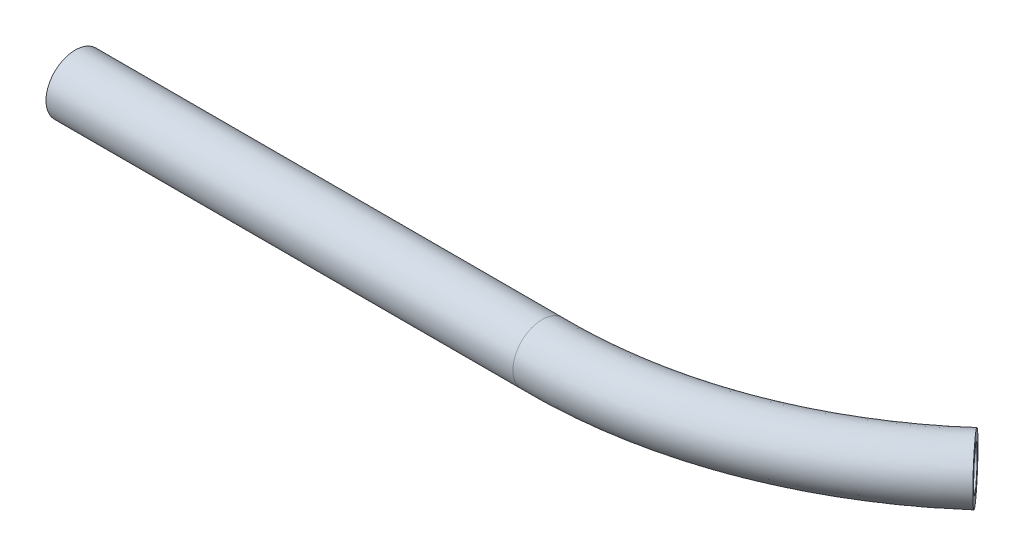
ISO-10303-21;
HEADER;
FILE_DESCRIPTION(('STEP AP214'),'2;1');
FILE_NAME('part.step','',(''),(''),'','','');
FILE_SCHEMA(('AUTOMOTIVE_DESIGN { 1 0 10303 214 1 1 1 1 }'));
ENDSEC;
DATA;
#1=APPLICATION_CONTEXT('core data for automotive mechanical design processes');
#2=APPLICATION_PROTOCOL_DEFINITION('international standard','automotive_design',2000,#1);
#3=PRODUCT_CONTEXT('',#1,'mechanical');
#4=PRODUCT('Part','Part','',(#3));
#5=PRODUCT_RELATED_PRODUCT_CATEGORY('part','',(#4));
#6=PRODUCT_DEFINITION_FORMATION('','',#4);
#7=PRODUCT_DEFINITION_CONTEXT('part definition',#1,'design');
#8=PRODUCT_DEFINITION('design','',#6,#7);
#9=PRODUCT_DEFINITION_SHAPE('','',#8);
#10=(LENGTH_UNIT() NAMED_UNIT(*) SI_UNIT(.MILLI.,.METRE.));
#11=(NAMED_UNIT(*) PLANE_ANGLE_UNIT() SI_UNIT($,.RADIAN.));
#12=(NAMED_UNIT(*) SI_UNIT($,.STERADIAN.) SOLID_ANGLE_UNIT());
#13=UNCERTAINTY_MEASURE_WITH_UNIT(LENGTH_MEASURE(1.E-05),#10,'distance_accuracy_value','');
#14=(GEOMETRIC_REPRESENTATION_CONTEXT(3) GLOBAL_UNCERTAINTY_ASSIGNED_CONTEXT((#13)) GLOBAL_UNIT_ASSIGNED_CONTEXT((#10,
#11,#12)) REPRESENTATION_CONTEXT('',''));
#15=CARTESIAN_POINT('',(0.,0.,0.));
#16=DIRECTION('',(0.,0.,1.));
#17=DIRECTION('',(1.,0.,0.));
#18=AXIS2_PLACEMENT_3D('',#15,#16,#17);
#19=CARTESIAN_POINT('',(-38.1,0.,0.));
#20=DIRECTION('',(1.,0.,0.));
#21=DIRECTION('',(0.,0.,-1.));
#22=AXIS2_PLACEMENT_3D('',#19,#20,#21);
#23=PLANE('',#22);
#24=CARTESIAN_POINT('',(-38.1,0.,0.));
#25=DIRECTION('',(1.,0.,0.));
#26=DIRECTION('',(0.,0.,-1.));
#27=AXIS2_PLACEMENT_3D('',#24,#25,#26);
#28=CIRCLE('',#27,4.7625);
#29=CARTESIAN_POINT('',(-38.1,0.,4.7625));
#30=VERTEX_POINT('',#29);
#31=EDGE_CURVE('E36',#30,#30,#28,.T.);
#32=ORIENTED_EDGE('',*,*,#31,.F.);
#33=EDGE_LOOP('',(#32));
#34=FACE_BOUND('',#33,.T.);
#35=CARTESIAN_POINT('',(-38.1,0.,0.));
#36=DIRECTION('',(1.,0.,0.));
#37=DIRECTION('',(0.,0.,-1.));
#38=AXIS2_PLACEMENT_3D('',#35,#36,#37);
#39=CIRCLE('',#38,3.175);
#40=CARTESIAN_POINT('',(-38.1,0.,3.175));
#41=VERTEX_POINT('',#40);
#42=EDGE_CURVE('E43',#41,#41,#39,.T.);
#43=ORIENTED_EDGE('',*,*,#42,.T.);
#44=EDGE_LOOP('',(#43));
#45=FACE_BOUND('',#44,.T.);
#46=ADVANCED_FACE('F32',(#34,#45),#23,.F.);
#47=CARTESIAN_POINT('',(38.1,0.,0.));
#48=DIRECTION('',(-1.,0.,0.));
#49=DIRECTION('',(0.,0.,1.));
#50=AXIS2_PLACEMENT_3D('',#47,#48,#49);
#51=CYLINDRICAL_SURFACE('',#50,4.7625);
#52=CARTESIAN_POINT('',(38.1,0.,0.));
#53=DIRECTION('',(1.,0.,0.));
#54=DIRECTION('',(0.,0.,-1.));
#55=AXIS2_PLACEMENT_3D('',#52,#53,#54);
#56=CIRCLE('',#55,4.7625);
#57=CARTESIAN_POINT('',(38.1,0.,4.7625));
#58=VERTEX_POINT('',#57);
#59=EDGE_CURVE('E10',#58,#58,#56,.T.);
#60=CARTESIAN_POINT('',(38.1,0.,4.7625));
#61=CARTESIAN_POINT('',(37.30625,0.,4.7625));
#62=CARTESIAN_POINT('',(36.5125,0.,4.7625));
#63=CARTESIAN_POINT('',(34.925,0.,4.7625));
#64=CARTESIAN_POINT('',(34.13125,0.,4.7625));
#65=CARTESIAN_POINT('',(32.54375,0.,4.7625));
#66=CARTESIAN_POINT('',(31.75,0.,4.7625));
#67=CARTESIAN_POINT('',(30.1625,0.,4.7625));
#68=CARTESIAN_POINT('',(29.36875,0.,4.7625));
#69=CARTESIAN_POINT('',(27.78125,0.,4.7625));
#70=CARTESIAN_POINT('',(26.9875,0.,4.7625));
#71=CARTESIAN_POINT('',(25.4,0.,4.7625));
#72=CARTESIAN_POINT('',(24.60625,0.,4.7625));
#73=CARTESIAN_POINT('',(23.01875,0.,4.7625));
#74=CARTESIAN_POINT('',(22.225,0.,4.7625));
#75=CARTESIAN_POINT('',(20.6375,0.,4.7625));
#76=CARTESIAN_POINT('',(19.84375,0.,4.7625));
#77=CARTESIAN_POINT('',(18.25625,0.,4.7625));
#78=CARTESIAN_POINT('',(17.4625,0.,4.7625));
#79=CARTESIAN_POINT('',(15.875,0.,4.7625));
#80=CARTESIAN_POINT('',(15.08125,0.,4.7625));
#81=CARTESIAN_POINT('',(13.49375,0.,4.7625));
#82=CARTESIAN_POINT('',(12.7,0.,4.7625));
#83=CARTESIAN_POINT('',(11.1125,0.,4.7625));
#84=CARTESIAN_POINT('',(10.31875,0.,4.7625));
#85=CARTESIAN_POINT('',(8.73124999999999,0.,4.7625));
#86=CARTESIAN_POINT('',(7.93749999999999,0.,4.7625));
#87=CARTESIAN_POINT('',(6.35,0.,4.7625));
#88=CARTESIAN_POINT('',(5.55625,0.,4.7625));
#89=CARTESIAN_POINT('',(3.96875,0.,4.7625));
#90=CARTESIAN_POINT('',(3.175,0.,4.7625));
#91=CARTESIAN_POINT('',(1.5875,0.,4.7625));
#92=CARTESIAN_POINT('',(0.793750000000001,0.,4.7625));
#93=CARTESIAN_POINT('',(-0.793750000000001,0.,4.7625));
#94=CARTESIAN_POINT('',(-1.5875,0.,4.7625));
#95=CARTESIAN_POINT('',(-3.175,0.,4.7625));
#96=CARTESIAN_POINT('',(-3.96875,0.,4.7625));
#97=CARTESIAN_POINT('',(-5.55625,0.,4.7625));
#98=CARTESIAN_POINT('',(-6.35,0.,4.7625));
#99=CARTESIAN_POINT('',(-7.93750000000001,0.,4.7625));
#100=CARTESIAN_POINT('',(-8.73125,0.,4.7625));
#101=CARTESIAN_POINT('',(-10.31875,0.,4.7625));
#102=CARTESIAN_POINT('',(-11.1125,0.,4.7625));
#103=CARTESIAN_POINT('',(-12.7,0.,4.7625));
#104=CARTESIAN_POINT('',(-13.49375,0.,4.7625));
#105=CARTESIAN_POINT('',(-15.08125,0.,4.7625));
#106=CARTESIAN_POINT('',(-15.875,0.,4.7625));
#107=CARTESIAN_POINT('',(-17.4625,0.,4.7625));
#108=CARTESIAN_POINT('',(-18.25625,0.,4.7625));
#109=CARTESIAN_POINT('',(-19.84375,0.,4.7625));
#110=CARTESIAN_POINT('',(-20.6375,0.,4.7625));
#111=CARTESIAN_POINT('',(-22.225,0.,4.7625));
#112=CARTESIAN_POINT('',(-23.01875,0.,4.7625));
#113=CARTESIAN_POINT('',(-24.60625,0.,4.7625));
#114=CARTESIAN_POINT('',(-25.4,0.,4.7625));
#115=CARTESIAN_POINT('',(-26.9875,0.,4.7625));
#116=CARTESIAN_POINT('',(-27.78125,0.,4.7625));
#117=CARTESIAN_POINT('',(-29.36875,0.,4.7625));
#118=CARTESIAN_POINT('',(-30.1625,0.,4.7625));
#119=CARTESIAN_POINT('',(-31.75,0.,4.7625));
#120=CARTESIAN_POINT('',(-32.54375,0.,4.7625));
#121=CARTESIAN_POINT('',(-34.13125,0.,4.7625));
#122=CARTESIAN_POINT('',(-34.925,0.,4.7625));
#123=CARTESIAN_POINT('',(-36.5125,0.,4.7625));
#124=CARTESIAN_POINT('',(-37.30625,0.,4.7625));
#125=CARTESIAN_POINT('',(-38.1,0.,4.7625));
#126=B_SPLINE_CURVE_WITH_KNOTS('',3,(#60,#61,#62,#63,#64,#65,#66,#67,#68,#69,#70,#71,#72,#73,
#74,#75,#76,#77,#78,#79,#80,#81,#82,#83,#84,#85,#86,#87,#88,#89,#90,#91,#92,#93,#94,#95,#96,#97,
#98,#99,#100,#101,#102,#103,#104,#105,#106,#107,#108,#109,#110,#111,#112,#113,#114,#115,#116,
#117,#118,#119,#120,#121,#122,#123,#124,#125),.UNSPECIFIED.,.F.,.F.,(4,2,2,2,2,2,2,2,2,2,2,2,2,
2,2,2,2,2,2,2,2,2,2,2,2,2,2,2,2,2,2,2,4),(0.,2.38125,4.7625,7.14375,9.52500000000001,11.90625,
14.2875,16.66875,19.05,21.43125,23.8125,26.19375,28.575,30.95625,33.3375,35.71875,38.1,40.48125,
42.8625,45.24375,47.625,50.00625,52.3875,54.76875,57.15,59.53125,61.9125,64.29375,66.675,
69.05625,71.4375,73.81875,76.2),.UNSPECIFIED.);
#127=EDGE_CURVE('BSEAM34',#58,#30,#126,.T.);
#128=ORIENTED_EDGE('',*,*,#59,.F.);
#129=ORIENTED_EDGE('',*,*,#31,.T.);
#130=ORIENTED_EDGE('',*,*,#127,.T.);
#131=ORIENTED_EDGE('',*,*,#127,.F.);
#132=EDGE_LOOP('',(#128,#130,#129,#131));
#133=FACE_BOUND('',#132,.T.);
#134=ADVANCED_FACE('F34',(#133),#51,.T.);
#135=CARTESIAN_POINT('',(38.1,0.,0.));
#136=DIRECTION('',(-1.,0.,0.));
#137=DIRECTION('',(0.,0.,1.));
#138=AXIS2_PLACEMENT_3D('',#135,#136,#137);
#139=CYLINDRICAL_SURFACE('',#138,3.175);
#140=CARTESIAN_POINT('',(38.1,0.,0.));
#141=DIRECTION('',(1.,0.,0.));
#142=DIRECTION('',(0.,0.,-1.));
#143=AXIS2_PLACEMENT_3D('',#140,#141,#142);
#144=CIRCLE('',#143,3.175);
#145=CARTESIAN_POINT('',(38.1,0.,3.175));
#146=VERTEX_POINT('',#145);
#147=EDGE_CURVE('E51',#146,#146,#144,.F.);
#148=CARTESIAN_POINT('',(38.1,0.,3.175));
#149=CARTESIAN_POINT('',(37.30625,0.,3.175));
#150=CARTESIAN_POINT('',(36.5125,0.,3.175));
#151=CARTESIAN_POINT('',(34.925,0.,3.175));
#152=CARTESIAN_POINT('',(34.13125,0.,3.175));
#153=CARTESIAN_POINT('',(32.54375,0.,3.175));
#154=CARTESIAN_POINT('',(31.75,0.,3.175));
#155=CARTESIAN_POINT('',(30.1625,0.,3.175));
#156=CARTESIAN_POINT('',(29.36875,0.,3.175));
#157=CARTESIAN_POINT('',(27.78125,0.,3.175));
#158=CARTESIAN_POINT('',(26.9875,0.,3.175));
#159=CARTESIAN_POINT('',(25.4,0.,3.175));
#160=CARTESIAN_POINT('',(24.60625,0.,3.175));
#161=CARTESIAN_POINT('',(23.01875,0.,3.175));
#162=CARTESIAN_POINT('',(22.225,0.,3.175));
#163=CARTESIAN_POINT('',(20.6375,0.,3.175));
#164=CARTESIAN_POINT('',(19.84375,0.,3.175));
#165=CARTESIAN_POINT('',(18.25625,0.,3.175));
#166=CARTESIAN_POINT('',(17.4625,0.,3.175));
#167=CARTESIAN_POINT('',(15.875,0.,3.175));
#168=CARTESIAN_POINT('',(15.08125,0.,3.175));
#169=CARTESIAN_POINT('',(13.49375,0.,3.175));
#170=CARTESIAN_POINT('',(12.7,0.,3.175));
#171=CARTESIAN_POINT('',(11.1125,0.,3.175));
#172=CARTESIAN_POINT('',(10.31875,0.,3.175));
#173=CARTESIAN_POINT('',(8.73124999999999,0.,3.175));
#174=CARTESIAN_POINT('',(7.93749999999999,0.,3.175));
#175=CARTESIAN_POINT('',(6.35,0.,3.175));
#176=CARTESIAN_POINT('',(5.55625,0.,3.175));
#177=CARTESIAN_POINT('',(3.96875,0.,3.175));
#178=CARTESIAN_POINT('',(3.175,0.,3.175));
#179=CARTESIAN_POINT('',(1.5875,0.,3.175));
#180=CARTESIAN_POINT('',(0.793750000000001,0.,3.175));
#181=CARTESIAN_POINT('',(-0.793750000000001,0.,3.175));
#182=CARTESIAN_POINT('',(-1.5875,0.,3.175));
#183=CARTESIAN_POINT('',(-3.175,0.,3.175));
#184=CARTESIAN_POINT('',(-3.96875,0.,3.175));
#185=CARTESIAN_POINT('',(-5.55625,0.,3.175));
#186=CARTESIAN_POINT('',(-6.35,0.,3.175));
#187=CARTESIAN_POINT('',(-7.93750000000001,0.,3.175));
#188=CARTESIAN_POINT('',(-8.73125,0.,3.175));
#189=CARTESIAN_POINT('',(-10.31875,0.,3.175));
#190=CARTESIAN_POINT('',(-11.1125,0.,3.175));
#191=CARTESIAN_POINT('',(-12.7,0.,3.175));
#192=CARTESIAN_POINT('',(-13.49375,0.,3.175));
#193=CARTESIAN_POINT('',(-15.08125,0.,3.175));
#194=CARTESIAN_POINT('',(-15.875,0.,3.175));
#195=CARTESIAN_POINT('',(-17.4625,0.,3.175));
#196=CARTESIAN_POINT('',(-18.25625,0.,3.175));
#197=CARTESIAN_POINT('',(-19.84375,0.,3.175));
#198=CARTESIAN_POINT('',(-20.6375,0.,3.175));
#199=CARTESIAN_POINT('',(-22.225,0.,3.175));
#200=CARTESIAN_POINT('',(-23.01875,0.,3.175));
#201=CARTESIAN_POINT('',(-24.60625,0.,3.175));
#202=CARTESIAN_POINT('',(-25.4,0.,3.175));
#203=CARTESIAN_POINT('',(-26.9875,0.,3.175));
#204=CARTESIAN_POINT('',(-27.78125,0.,3.175));
#205=CARTESIAN_POINT('',(-29.36875,0.,3.175));
#206=CARTESIAN_POINT('',(-30.1625,0.,3.175));
#207=CARTESIAN_POINT('',(-31.75,0.,3.175));
#208=CARTESIAN_POINT('',(-32.54375,0.,3.175));
#209=CARTESIAN_POINT('',(-34.13125,0.,3.175));
#210=CARTESIAN_POINT('',(-34.925,0.,3.175));
#211=CARTESIAN_POINT('',(-36.5125,0.,3.175));
#212=CARTESIAN_POINT('',(-37.30625,0.,3.175));
#213=CARTESIAN_POINT('',(-38.1,0.,3.175));
#214=B_SPLINE_CURVE_WITH_KNOTS('',3,(#148,#149,#150,#151,#152,#153,#154,#155,#156,#157,#158,
#159,#160,#161,#162,#163,#164,#165,#166,#167,#168,#169,#170,#171,#172,#173,#174,#175,#176,#177,
#178,#179,#180,#181,#182,#183,#184,#185,#186,#187,#188,#189,#190,#191,#192,#193,#194,#195,#196,
#197,#198,#199,#200,#201,#202,#203,#204,#205,#206,#207,#208,#209,#210,#211,#212,#213),
.UNSPECIFIED.,.F.,.F.,(4,2,2,2,2,2,2,2,2,2,2,2,2,2,2,2,2,2,2,2,2,2,2,2,2,2,2,2,2,2,2,2,4),(0.,
2.38125,4.7625,7.14375,9.52500000000001,11.90625,14.2875,16.66875,19.05,21.43125,23.8125,
26.19375,28.575,30.95625,33.3375,35.71875,38.1,40.48125,42.8625,45.24375,47.625,50.00625,
52.3875,54.76875,57.15,59.53125,61.9125,64.29375,66.675,69.05625,71.4375,73.81875,76.2),.UNSPECIFIED.);
#215=EDGE_CURVE('BSEAM59',#146,#41,#214,.T.);
#216=ORIENTED_EDGE('',*,*,#147,.F.);
#217=ORIENTED_EDGE('',*,*,#42,.F.);
#218=ORIENTED_EDGE('',*,*,#215,.T.);
#219=ORIENTED_EDGE('',*,*,#215,.F.);
#220=EDGE_LOOP('',(#216,#218,#217,#219));
#221=FACE_BOUND('',#220,.T.);
#222=ADVANCED_FACE('F59',(#221),#139,.F.);
#223=CARTESIAN_POINT('',(38.1,0.,-4.7625));
#224=CARTESIAN_POINT('',(38.5233333333352,0.,-4.7625));
#225=CARTESIAN_POINT('',(38.9598958353734,0.,-4.76249869791609));
#226=CARTESIAN_POINT('',(39.9257431092748,0.,-4.76250176448869));
#227=CARTESIAN_POINT('',(40.4456225058404,0.,-4.7685736186369));
#228=CARTESIAN_POINT('',(41.5209548119998,0.,-4.79286427780509));
#229=CARTESIAN_POINT('',(42.0584805063859,0.,-4.81108133236324));
#230=CARTESIAN_POINT('',(43.6702373000608,0.,-4.88393389787033));
#231=CARTESIAN_POINT('',(44.7436492433766,0.,-4.95677387682769));
#232=CARTESIAN_POINT('',(47.9573643709158,0.,-5.2478932453284));
#233=CARTESIAN_POINT('',(50.0911467402979,0.,-5.53882478872198));
#234=CARTESIAN_POINT('',(56.4401020379097,0.,-6.69862536373779));
#235=CARTESIAN_POINT('',(60.6023246095154,0.,-7.85516450528365));
#236=CARTESIAN_POINT('',(72.6762618024901,0.,-12.4186838136851));
#237=CARTESIAN_POINT('',(80.1668383363917,0.,-16.9294295050889));
#238=CARTESIAN_POINT('',(86.6214648210442,0.,-22.621875));
#239=CARTESIAN_POINT('',(38.1,9.525,-4.7625));
#240=CARTESIAN_POINT('',(38.5233333333352,9.525,-4.7625));
#241=CARTESIAN_POINT('',(38.9598958353734,9.525,-4.76249869791609));
#242=CARTESIAN_POINT('',(39.9257431092748,9.525,-4.76250176448869));
#243=CARTESIAN_POINT('',(40.4456225058404,9.525,-4.7685736186369));
#244=CARTESIAN_POINT('',(41.5209548119998,9.525,-4.79286427780509));
#245=CARTESIAN_POINT('',(42.0584805063859,9.525,-4.81108133236324));
#246=CARTESIAN_POINT('',(43.6702373000608,9.525,-4.88393389787033));
#247=CARTESIAN_POINT('',(44.7436492433766,9.525,-4.95677387682769));
#248=CARTESIAN_POINT('',(47.9573643709158,9.525,-5.2478932453284));
#249=CARTESIAN_POINT('',(50.0911467402979,9.525,-5.53882478872198));
#250=CARTESIAN_POINT('',(56.4401020379097,9.525,-6.69862536373779));
#251=CARTESIAN_POINT('',(60.6023246095154,9.525,-7.85516450528365));
#252=CARTESIAN_POINT('',(72.6762618024901,9.525,-12.4186838136851));
#253=CARTESIAN_POINT('',(80.1668383363917,9.525,-16.9294295050889));
#254=CARTESIAN_POINT('',(86.6214648210442,9.525,-22.621875));
#255=CARTESIAN_POINT('',(38.1,9.525,4.7625));
#256=CARTESIAN_POINT('',(38.5233333333352,9.525,4.7625));
#257=CARTESIAN_POINT('',(38.9334375023125,9.525,4.7625014756947));
#258=CARTESIAN_POINT('',(39.9615975032308,9.525,4.76249800024669));
#259=CARTESIAN_POINT('',(40.5890388399519,9.525,4.75561656554485));
#260=CARTESIAN_POINT('',(41.8077487869336,9.525,4.72808715182089));
#261=CARTESIAN_POINT('',(42.416944573904,9.525,4.70744115665499));
#262=CARTESIAN_POINT('',(44.2436022734022,9.525,4.62487491574696));
#263=CARTESIAN_POINT('',(45.4601358091617,9.525,4.54232293959528));
#264=CARTESIAN_POINT('',(49.1023462870347,9.525,4.21238765529449));
#265=CARTESIAN_POINT('',(51.5206329723429,9.525,3.88266523944793));
#266=CARTESIAN_POINT('',(58.7161156429537,9.525,2.56822458776484));
#267=CARTESIAN_POINT('',(63.4333012240666,9.525,1.25748022733843));
#268=CARTESIAN_POINT('',(77.1170967095907,9.525,-3.91450832216292));
#269=CARTESIAN_POINT('',(85.6064167813246,9.525,-9.02668677247442));
#270=CARTESIAN_POINT('',(92.9216601305167,9.525,-15.478125));
#271=CARTESIAN_POINT('',(38.1,0.,4.7625));
#272=CARTESIAN_POINT('',(38.5233333333352,0.,4.7625));
#273=CARTESIAN_POINT('',(38.9334375023125,0.,4.7625014756947));
#274=CARTESIAN_POINT('',(39.9615975032308,0.,4.76249800024669));
#275=CARTESIAN_POINT('',(40.5890388399519,0.,4.75561656554485));
#276=CARTESIAN_POINT('',(41.8077487869336,0.,4.72808715182089));
#277=CARTESIAN_POINT('',(42.416944573904,0.,4.70744115665499));
#278=CARTESIAN_POINT('',(44.2436022734022,0.,4.62487491574696));
#279=CARTESIAN_POINT('',(45.4601358091617,0.,4.54232293959528));
#280=CARTESIAN_POINT('',(49.1023462870347,0.,4.21238765529449));
#281=CARTESIAN_POINT('',(51.5206329723429,0.,3.88266523944743));
#282=CARTESIAN_POINT('',(58.7161156429537,0.,2.56822458776583));
#283=CARTESIAN_POINT('',(63.4333012240666,0.,1.25748022733644));
#284=CARTESIAN_POINT('',(77.1170967095907,0.,-3.91450832215894));
#285=CARTESIAN_POINT('',(85.6064167813246,0.,-9.02668677250627));
#286=CARTESIAN_POINT('',(92.9216601305167,0.,-15.478125));
#287=CARTESIAN_POINT('',(38.1,-9.525,4.7625));
#288=CARTESIAN_POINT('',(38.5233333333352,-9.525,4.7625));
#289=CARTESIAN_POINT('',(38.9334375023125,-9.525,4.7625014756947));
#290=CARTESIAN_POINT('',(39.9615975032308,-9.525,4.76249800024669));
#291=CARTESIAN_POINT('',(40.5890388399519,-9.525,4.75561656554485));
#292=CARTESIAN_POINT('',(41.8077487869336,-9.525,4.72808715182089));
#293=CARTESIAN_POINT('',(42.416944573904,-9.525,4.70744115665499));
#294=CARTESIAN_POINT('',(44.2436022734022,-9.525,4.62487491574696));
#295=CARTESIAN_POINT('',(45.4601358091617,-9.525,4.54232293959528));
#296=CARTESIAN_POINT('',(49.1023462870347,-9.525,4.21238765529449));
#297=CARTESIAN_POINT('',(51.5206329723429,-9.525,3.88266523944693));
#298=CARTESIAN_POINT('',(58.7161156429537,-9.525,2.56822458776683));
#299=CARTESIAN_POINT('',(63.4333012240666,-9.525,1.25748022733445));
#300=CARTESIAN_POINT('',(77.1170967095907,-9.525,-3.91450832215496));
#301=CARTESIAN_POINT('',(85.6064167813246,-9.525,-9.02668677253812));
#302=CARTESIAN_POINT('',(92.9216601305167,-9.525,-15.478125));
#303=CARTESIAN_POINT('',(38.1,-9.525,-4.7625));
#304=CARTESIAN_POINT('',(38.5233333333352,-9.525,-4.7625));
#305=CARTESIAN_POINT('',(38.9598958353734,-9.525,-4.76249869791609));
#306=CARTESIAN_POINT('',(39.9257431092748,-9.525,-4.76250176448869));
#307=CARTESIAN_POINT('',(40.4456225058404,-9.525,-4.7685736186369));
#308=CARTESIAN_POINT('',(41.5209548119998,-9.525,-4.79286427780509));
#309=CARTESIAN_POINT('',(42.0584805063859,-9.525,-4.81108133236324));
#310=CARTESIAN_POINT('',(43.6702373000608,-9.525,-4.88393389787033));
#311=CARTESIAN_POINT('',(44.7436492433766,-9.525,-4.95677387682769));
#312=CARTESIAN_POINT('',(47.9573643709158,-9.525,-5.2478932453284));
#313=CARTESIAN_POINT('',(50.0911467402979,-9.525,-5.53882478872198));
#314=CARTESIAN_POINT('',(56.4401020379097,-9.525,-6.69862536373779));
#315=CARTESIAN_POINT('',(60.6023246095154,-9.525,-7.85516450528365));
#316=CARTESIAN_POINT('',(72.6762618024901,-9.525,-12.4186838136851));
#317=CARTESIAN_POINT('',(80.1668383363917,-9.525,-16.9294295050889));
#318=CARTESIAN_POINT('',(86.6214648210442,-9.525,-22.621875));
#319=CARTESIAN_POINT('',(38.1,0.,-4.7625));
#320=CARTESIAN_POINT('',(38.5233333333352,0.,-4.7625));
#321=CARTESIAN_POINT('',(38.9598958353734,0.,-4.76249869791609));
#322=CARTESIAN_POINT('',(39.9257431092748,0.,-4.76250176448869));
#323=CARTESIAN_POINT('',(40.4456225058404,0.,-4.7685736186369));
#324=CARTESIAN_POINT('',(41.5209548119998,0.,-4.79286427780509));
#325=CARTESIAN_POINT('',(42.0584805063859,0.,-4.81108133236324));
#326=CARTESIAN_POINT('',(43.6702373000608,0.,-4.88393389787033));
#327=CARTESIAN_POINT('',(44.7436492433766,0.,-4.95677387682769));
#328=CARTESIAN_POINT('',(47.9573643709158,0.,-5.2478932453284));
#329=CARTESIAN_POINT('',(50.0911467402979,0.,-5.53882478872198));
#330=CARTESIAN_POINT('',(56.4401020379097,0.,-6.69862536373779));
#331=CARTESIAN_POINT('',(60.6023246095154,0.,-7.85516450528365));
#332=CARTESIAN_POINT('',(72.6762618024901,0.,-12.4186838136851));
#333=CARTESIAN_POINT('',(80.1668383363917,0.,-16.9294295050889));
#334=CARTESIAN_POINT('',(86.6214648210442,0.,-22.621875));
#335=(BOUNDED_SURFACE() B_SPLINE_SURFACE(3,3,((#223,#224,#225,#226,#227,#228,#229,#230,#231,
#232,#233,#234,#235,#236,#237,#238),(#239,#240,#241,#242,#243,#244,#245,#246,#247,#248,#249,
#250,#251,#252,#253,#254),(#255,#256,#257,#258,#259,#260,#261,#262,#263,#264,#265,#266,#267,
#268,#269,#270),(#271,#272,#273,#274,#275,#276,#277,#278,#279,#280,#281,#282,#283,#284,#285,
#286),(#287,#288,#289,#290,#291,#292,#293,#294,#295,#296,#297,#298,#299,#300,#301,#302),(#303,
#304,#305,#306,#307,#308,#309,#310,#311,#312,#313,#314,#315,#316,#317,#318),(#319,#320,#321,
#322,#323,#324,#325,#326,#327,#328,#329,#330,#331,#332,#333,#334)),.UNSPECIFIED.,.T.,.F.,
.F.) B_SPLINE_SURFACE_WITH_KNOTS((4,3,4),(4,2,2,2,2,2,2,4),(0.,0.5,1.),(0.,0.0225407709677855,
0.0530863718750422,0.0836319727822989,0.144723174596812,0.266905578225839,0.511270385483893,1.),
.UNSPECIFIED.) GEOMETRIC_REPRESENTATION_ITEM() RATIONAL_B_SPLINE_SURFACE(((1.,1.,1.,1.,1.,1.,1.,
1.,1.,1.,1.,1.,1.,1.,1.,1.),(0.333333333333333,0.333333333333333,0.333333333333333,
0.333333333333333,0.333333333333333,0.333333333333333,0.333333333333333,0.333333333333333,
0.333333333333333,0.333333333333333,0.333333333333333,0.333333333333333,0.333333333333333,
0.333333333333333,0.333333333333333,0.333333333333333),(0.333333333333333,0.333333333333333,
0.333333333333333,0.333333333333333,0.333333333333333,0.333333333333333,0.333333333333333,
0.333333333333333,0.333333333333333,0.333333333333333,0.333333333333333,0.333333333333333,
0.333333333333333,0.333333333333333,0.333333333333333,0.333333333333333),(1.,1.,1.,1.,1.,1.,1.,
1.,1.,1.,1.,1.,1.,1.,1.,1.),(0.333333333333333,0.333333333333333,0.333333333333333,
0.333333333333333,0.333333333333333,0.333333333333333,0.333333333333333,0.333333333333333,
0.333333333333333,0.333333333333333,0.333333333333333,0.333333333333333,0.333333333333333,
0.333333333333333,0.333333333333333,0.333333333333333),(0.333333333333333,0.333333333333333,
0.333333333333333,0.333333333333333,0.333333333333333,0.333333333333333,0.333333333333333,
0.333333333333333,0.333333333333333,0.333333333333333,0.333333333333333,0.333333333333333,
0.333333333333333,0.333333333333333,0.333333333333333,0.333333333333333),(1.,1.,1.,1.,1.,1.,1.,
1.,1.,1.,1.,1.,1.,1.,1.,1.))) REPRESENTATION_ITEM('') SURFACE());
#336=CARTESIAN_POINT('',(89.7715624757804,0.,-19.05));
#337=DIRECTION('',(0.75,0.,-0.661437827766147));
#338=DIRECTION('',(-0.661437827766148,0.,-0.75));
#339=AXIS2_PLACEMENT_3D('',#336,#337,#338);
#340=CIRCLE('',#339,4.7625);
#341=CARTESIAN_POINT('',(86.6214648210442,0.,-22.621875));
#342=VERTEX_POINT('',#341);
#343=EDGE_CURVE('E48',#342,#342,#340,.T.);
#344=ORIENTED_EDGE('',*,*,#343,.F.);
#345=EDGE_LOOP('',(#344));
#346=FACE_BOUND('',#345,.T.);
#347=ORIENTED_EDGE('',*,*,#59,.T.);
#348=EDGE_LOOP('',(#347));
#349=FACE_BOUND('',#348,.T.);
#350=ADVANCED_FACE('F62',(#346,#349),#335,.T.);
#351=CARTESIAN_POINT('',(89.7715624757804,0.,-19.05));
#352=DIRECTION('',(0.75,0.,-0.661437827766147));
#353=DIRECTION('',(-0.661437827766148,0.,-0.75));
#354=AXIS2_PLACEMENT_3D('',#351,#352,#353);
#355=PLANE('',#354);
#356=CARTESIAN_POINT('',(89.7715624757804,0.,-19.05));
#357=DIRECTION('',(0.75,0.,-0.661437827766147));
#358=DIRECTION('',(-0.661437827766148,0.,-0.75));
#359=AXIS2_PLACEMENT_3D('',#356,#357,#358);
#360=CIRCLE('',#359,3.175);
#361=CARTESIAN_POINT('',(87.6714973726229,0.,-21.43125));
#362=VERTEX_POINT('',#361);
#363=EDGE_CURVE('E47',#362,#362,#360,.F.);
#364=ORIENTED_EDGE('',*,*,#363,.T.);
#365=EDGE_LOOP('',(#364));
#366=FACE_BOUND('',#365,.T.);
#367=ORIENTED_EDGE('',*,*,#343,.T.);
#368=EDGE_LOOP('',(#367));
#369=FACE_BOUND('',#368,.T.);
#370=ADVANCED_FACE('F78',(#366,#369),#355,.T.);
#371=CARTESIAN_POINT('',(38.1,0.,-3.175));
#372=CARTESIAN_POINT('',(38.5233333333352,0.,-3.175));
#373=CARTESIAN_POINT('',(38.9554861131961,0.,-3.17499866898096));
#374=CARTESIAN_POINT('',(39.9317188416015,0.,-3.17500180369946));
#375=CARTESIAN_POINT('',(40.4695252281923,0.,-3.18120858793977));
#376=CARTESIAN_POINT('',(41.5687538078221,0.,-3.20603903953426));
#377=CARTESIAN_POINT('',(42.1182245176382,0.,-3.22466091752687));
#378=CARTESIAN_POINT('',(43.7657981289524,0.,-3.29913242893411));
#379=CARTESIAN_POINT('',(44.8630636710088,0.,-3.3735910740902));
#380=CARTESIAN_POINT('',(48.1481946902663,0.,-3.67117976189191));
#381=CARTESIAN_POINT('',(50.3293944456361,0.,-3.96857645069325));
#382=CARTESIAN_POINT('',(56.8194376387557,0.,-5.15415037182151));
#383=CARTESIAN_POINT('',(61.0741540452846,0.,-6.33639038319025));
#384=CARTESIAN_POINT('',(73.4164009536523,0.,-11.0013212317442));
#385=CARTESIAN_POINT('',(81.0734347440397,0.,-15.6123057163357));
#386=CARTESIAN_POINT('',(87.6714973726229,0.,-21.43125));
#387=CARTESIAN_POINT('',(38.1,-6.35,-3.175));
#388=CARTESIAN_POINT('',(38.5233333333352,-6.35,-3.175));
#389=CARTESIAN_POINT('',(38.9554861131961,-6.35,-3.17499866898096));
#390=CARTESIAN_POINT('',(39.9317188416015,-6.35,-3.17500180369946));
#391=CARTESIAN_POINT('',(40.4695252281923,-6.35,-3.18120858793977));
#392=CARTESIAN_POINT('',(41.5687538078221,-6.35,-3.20603903953426));
#393=CARTESIAN_POINT('',(42.1182245176382,-6.35,-3.22466091752687));
#394=CARTESIAN_POINT('',(43.7657981289524,-6.35,-3.29913242893412));
#395=CARTESIAN_POINT('',(44.8630636710088,-6.35,-3.3735910740902));
#396=CARTESIAN_POINT('',(48.1481946902663,-6.35,-3.67117976189191));
#397=CARTESIAN_POINT('',(50.3293944456361,-6.35,-3.96857645069325));
#398=CARTESIAN_POINT('',(56.8194376387557,-6.35,-5.15415037182151));
#399=CARTESIAN_POINT('',(61.0741540452846,-6.35,-6.33639038319025));
#400=CARTESIAN_POINT('',(73.4164009536523,-6.35,-11.0013212317442));
#401=CARTESIAN_POINT('',(81.0734347440397,-6.35,-15.6123057163357));
#402=CARTESIAN_POINT('',(87.6714973726229,-6.35,-21.43125));
#403=CARTESIAN_POINT('',(38.1,-6.35,3.175));
#404=CARTESIAN_POINT('',(38.5233333333352,-6.35,3.175));
#405=CARTESIAN_POINT('',(38.9378472244898,-6.35,3.17500144675957));
#406=CARTESIAN_POINT('',(39.9556217709041,-6.35,3.17499803945746));
#407=CARTESIAN_POINT('',(40.5651361176,-6.35,3.16825153484773));
#408=CARTESIAN_POINT('',(41.7599497911113,-6.35,3.14126191355006));
#409=CARTESIAN_POINT('',(42.3572005626516,-6.35,3.12102074181862));
#410=CARTESIAN_POINT('',(44.1480414445107,-6.35,3.04007344681075));
#411=CARTESIAN_POINT('',(45.3407213815295,-6.35,2.95914013685829));
#412=CARTESIAN_POINT('',(48.9115159676842,-6.35,2.63567417185701));
#413=CARTESIAN_POINT('',(51.2823852670047,-6.35,2.31241690141969));
#414=CARTESIAN_POINT('',(58.3367800421077,-6.35,1.02374959584757));
#415=CARTESIAN_POINT('',(62.9614717882974,-6.35,-0.261293894768896));
#416=CARTESIAN_POINT('',(76.3769575584285,-6.35,-5.33187090407599));
#417=CARTESIAN_POINT('',(84.6998203738676,-6.35,-10.3438105612594));
#418=CARTESIAN_POINT('',(91.871627578938,-6.35,-16.66875));
#419=CARTESIAN_POINT('',(38.1,0.,3.175));
#420=CARTESIAN_POINT('',(38.5233333333352,0.,3.175));
#421=CARTESIAN_POINT('',(38.9378472244898,0.,3.17500144675957));
#422=CARTESIAN_POINT('',(39.9556217709041,0.,3.17499803945746));
#423=CARTESIAN_POINT('',(40.5651361176,0.,3.16825153484773));
#424=CARTESIAN_POINT('',(41.7599497911113,0.,3.14126191355006));
#425=CARTESIAN_POINT('',(42.3572005626516,0.,3.12102074181862));
#426=CARTESIAN_POINT('',(44.1480414445107,0.,3.04007344681074));
#427=CARTESIAN_POINT('',(45.3407213815295,0.,2.95914013685829));
#428=CARTESIAN_POINT('',(48.9115159676842,0.,2.63567417185701));
#429=CARTESIAN_POINT('',(51.2823852670047,0.,2.31241690141969));
#430=CARTESIAN_POINT('',(58.3367800421077,0.,1.02374959584757));
#431=CARTESIAN_POINT('',(62.9614717882974,0.,-0.261293894768896));
#432=CARTESIAN_POINT('',(76.3769575584285,0.,-5.33187090407599));
#433=CARTESIAN_POINT('',(84.6998203738676,0.,-10.3438105612594));
#434=CARTESIAN_POINT('',(91.871627578938,0.,-16.66875));
#435=CARTESIAN_POINT('',(38.1,6.35,3.175));
#436=CARTESIAN_POINT('',(38.5233333333352,6.35,3.175));
#437=CARTESIAN_POINT('',(38.9378472244898,6.35,3.17500144675957));
#438=CARTESIAN_POINT('',(39.9556217709041,6.35,3.17499803945746));
#439=CARTESIAN_POINT('',(40.5651361176,6.35,3.16825153484772));
#440=CARTESIAN_POINT('',(41.7599497911113,6.35,3.14126191355006));
#441=CARTESIAN_POINT('',(42.3572005626516,6.35,3.12102074181862));
#442=CARTESIAN_POINT('',(44.1480414445107,6.35,3.04007344681074));
#443=CARTESIAN_POINT('',(45.3407213815295,6.35,2.95914013685828));
#444=CARTESIAN_POINT('',(48.9115159676842,6.35,2.63567417185701));
#445=CARTESIAN_POINT('',(51.2823852670047,6.35,2.31241690141969));
#446=CARTESIAN_POINT('',(58.3367800421077,6.35,1.02374959584757));
#447=CARTESIAN_POINT('',(62.9614717882974,6.35,-0.261293894768896));
#448=CARTESIAN_POINT('',(76.3769575584285,6.35,-5.33187090407599));
#449=CARTESIAN_POINT('',(84.6998203738676,6.35,-10.3438105612594));
#450=CARTESIAN_POINT('',(91.871627578938,6.35,-16.66875));
#451=CARTESIAN_POINT('',(38.1,6.35,-3.175));
#452=CARTESIAN_POINT('',(38.5233333333352,6.35,-3.175));
#453=CARTESIAN_POINT('',(38.9554861131961,6.35,-3.17499866898096));
#454=CARTESIAN_POINT('',(39.9317188416015,6.35,-3.17500180369946));
#455=CARTESIAN_POINT('',(40.4695252281923,6.35,-3.18120858793977));
#456=CARTESIAN_POINT('',(41.5687538078221,6.35,-3.20603903953426));
#457=CARTESIAN_POINT('',(42.1182245176382,6.35,-3.22466091752687));
#458=CARTESIAN_POINT('',(43.7657981289524,6.35,-3.29913242893412));
#459=CARTESIAN_POINT('',(44.8630636710088,6.35,-3.3735910740902));
#460=CARTESIAN_POINT('',(48.1481946902663,6.35,-3.67117976189191));
#461=CARTESIAN_POINT('',(50.3293944456361,6.35,-3.96857645069325));
#462=CARTESIAN_POINT('',(56.8194376387557,6.35,-5.15415037182151));
#463=CARTESIAN_POINT('',(61.0741540452846,6.35,-6.33639038319025));
#464=CARTESIAN_POINT('',(73.4164009536523,6.35,-11.0013212317442));
#465=CARTESIAN_POINT('',(81.0734347440397,6.35,-15.6123057163357));
#466=CARTESIAN_POINT('',(87.6714973726229,6.35,-21.43125));
#467=CARTESIAN_POINT('',(38.1,0.,-3.175));
#468=CARTESIAN_POINT('',(38.5233333333352,0.,-3.175));
#469=CARTESIAN_POINT('',(38.9554861131961,0.,-3.17499866898096));
#470=CARTESIAN_POINT('',(39.9317188416015,0.,-3.17500180369946));
#471=CARTESIAN_POINT('',(40.4695252281923,0.,-3.18120858793977));
#472=CARTESIAN_POINT('',(41.5687538078221,0.,-3.20603903953426));
#473=CARTESIAN_POINT('',(42.1182245176382,0.,-3.22466091752687));
#474=CARTESIAN_POINT('',(43.7657981289524,0.,-3.29913242893411));
#475=CARTESIAN_POINT('',(44.8630636710088,0.,-3.3735910740902));
#476=CARTESIAN_POINT('',(48.1481946902663,0.,-3.67117976189191));
#477=CARTESIAN_POINT('',(50.3293944456361,0.,-3.96857645069325));
#478=CARTESIAN_POINT('',(56.8194376387557,0.,-5.15415037182151));
#479=CARTESIAN_POINT('',(61.0741540452846,0.,-6.33639038319025));
#480=CARTESIAN_POINT('',(73.4164009536523,0.,-11.0013212317442));
#481=CARTESIAN_POINT('',(81.0734347440397,0.,-15.6123057163357));
#482=CARTESIAN_POINT('',(87.6714973726229,0.,-21.43125));
#483=(BOUNDED_SURFACE() B_SPLINE_SURFACE(3,3,((#371,#372,#373,#374,#375,#376,#377,#378,#379,
#380,#381,#382,#383,#384,#385,#386),(#387,#388,#389,#390,#391,#392,#393,#394,#395,#396,#397,
#398,#399,#400,#401,#402),(#403,#404,#405,#406,#407,#408,#409,#410,#411,#412,#413,#414,#415,
#416,#417,#418),(#419,#420,#421,#422,#423,#424,#425,#426,#427,#428,#429,#430,#431,#432,#433,
#434),(#435,#436,#437,#438,#439,#440,#441,#442,#443,#444,#445,#446,#447,#448,#449,#450),(#451,
#452,#453,#454,#455,#456,#457,#458,#459,#460,#461,#462,#463,#464,#465,#466),(#467,#468,#469,
#470,#471,#472,#473,#474,#475,#476,#477,#478,#479,#480,#481,#482)),.UNSPECIFIED.,.T.,.F.,
.F.) B_SPLINE_SURFACE_WITH_KNOTS((4,3,4),(4,2,2,2,2,2,2,4),(0.,0.5,1.),(0.,0.0225407709677855,
0.0530863718750422,0.0836319727822989,0.144723174596812,0.266905578225839,0.511270385483893,1.),
.UNSPECIFIED.) GEOMETRIC_REPRESENTATION_ITEM() RATIONAL_B_SPLINE_SURFACE(((1.,1.,1.,1.,1.,1.,1.,
1.,1.,1.,1.,1.,1.,1.,1.,1.),(0.333333333333333,0.333333333333333,0.333333333333333,
0.333333333333333,0.333333333333333,0.333333333333333,0.333333333333333,0.333333333333333,
0.333333333333333,0.333333333333333,0.333333333333333,0.333333333333333,0.333333333333333,
0.333333333333333,0.333333333333333,0.333333333333333),(0.333333333333333,0.333333333333333,
0.333333333333333,0.333333333333333,0.333333333333333,0.333333333333333,0.333333333333333,
0.333333333333333,0.333333333333333,0.333333333333333,0.333333333333333,0.333333333333333,
0.333333333333333,0.333333333333333,0.333333333333333,0.333333333333333),(1.,1.,1.,1.,1.,1.,1.,
1.,1.,1.,1.,1.,1.,1.,1.,1.),(0.333333333333333,0.333333333333333,0.333333333333333,
0.333333333333333,0.333333333333333,0.333333333333333,0.333333333333333,0.333333333333333,
0.333333333333333,0.333333333333333,0.333333333333333,0.333333333333333,0.333333333333333,
0.333333333333333,0.333333333333333,0.333333333333333),(0.333333333333333,0.333333333333333,
0.333333333333333,0.333333333333333,0.333333333333333,0.333333333333333,0.333333333333333,
0.333333333333333,0.333333333333333,0.333333333333333,0.333333333333333,0.333333333333333,
0.333333333333333,0.333333333333333,0.333333333333333,0.333333333333333),(1.,1.,1.,1.,1.,1.,1.,
1.,1.,1.,1.,1.,1.,1.,1.,1.))) REPRESENTATION_ITEM('') SURFACE());
#484=ORIENTED_EDGE('',*,*,#363,.F.);
#485=EDGE_LOOP('',(#484));
#486=FACE_BOUND('',#485,.T.);
#487=ORIENTED_EDGE('',*,*,#147,.T.);
#488=EDGE_LOOP('',(#487));
#489=FACE_BOUND('',#488,.T.);
#490=ADVANCED_FACE('F57',(#486,#489),#483,.T.);
#491=CLOSED_SHELL('',(#46,#134,#222,#350,#370,#490));
#492=MANIFOLD_SOLID_BREP('B2',#491);
#493=ADVANCED_BREP_SHAPE_REPRESENTATION('',(#18,#492),#14);
#494=SHAPE_DEFINITION_REPRESENTATION(#9,#493);
ENDSEC;
END-ISO-10303-21;
